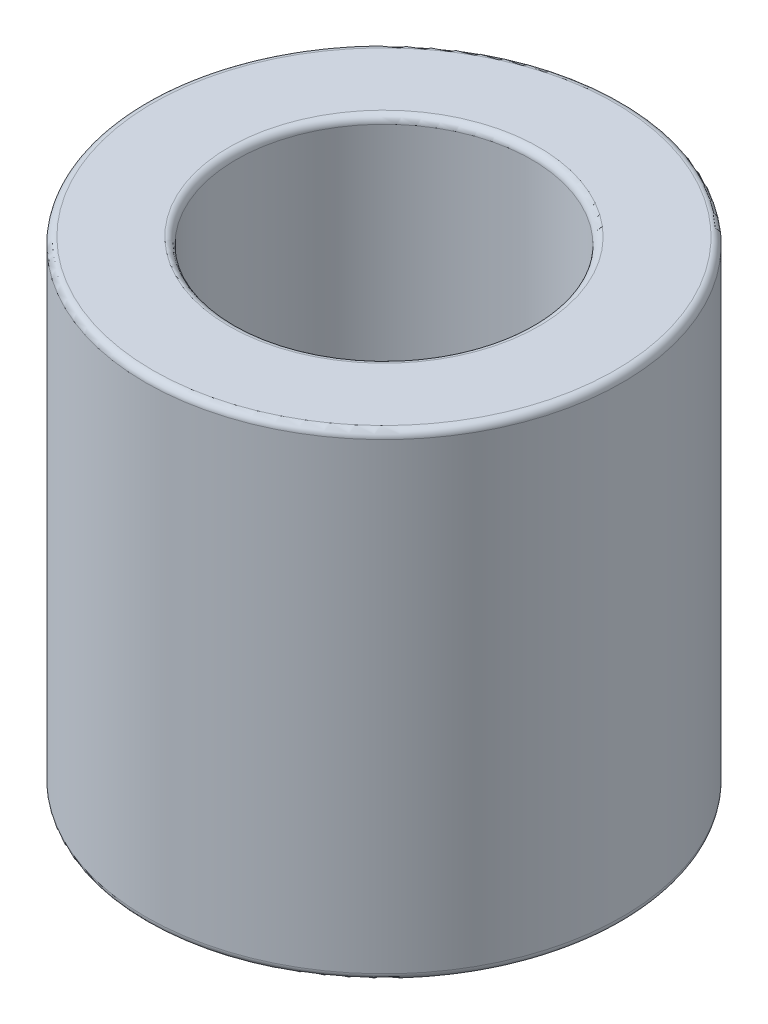
ISO-10303-21;
HEADER;
FILE_DESCRIPTION(('STEP AP214'),'2;1');
FILE_NAME('part.step','',(''),(''),'','','');
FILE_SCHEMA(('AUTOMOTIVE_DESIGN { 1 0 10303 214 1 1 1 1 }'));
ENDSEC;
DATA;
#1=APPLICATION_CONTEXT('core data for automotive mechanical design processes');
#2=APPLICATION_PROTOCOL_DEFINITION('international standard','automotive_design',2000,#1);
#3=PRODUCT_CONTEXT('',#1,'mechanical');
#4=PRODUCT('Part','Part','',(#3));
#5=PRODUCT_RELATED_PRODUCT_CATEGORY('part','',(#4));
#6=PRODUCT_DEFINITION_FORMATION('','',#4);
#7=PRODUCT_DEFINITION_CONTEXT('part definition',#1,'design');
#8=PRODUCT_DEFINITION('design','',#6,#7);
#9=PRODUCT_DEFINITION_SHAPE('','',#8);
#10=(LENGTH_UNIT() NAMED_UNIT(*) SI_UNIT(.MILLI.,.METRE.));
#11=(NAMED_UNIT(*) PLANE_ANGLE_UNIT() SI_UNIT($,.RADIAN.));
#12=(NAMED_UNIT(*) SI_UNIT($,.STERADIAN.) SOLID_ANGLE_UNIT());
#13=UNCERTAINTY_MEASURE_WITH_UNIT(LENGTH_MEASURE(1.E-05),#10,'distance_accuracy_value','');
#14=(GEOMETRIC_REPRESENTATION_CONTEXT(3) GLOBAL_UNCERTAINTY_ASSIGNED_CONTEXT((#13)) GLOBAL_UNIT_ASSIGNED_CONTEXT((#10,
#11,#12)) REPRESENTATION_CONTEXT('',''));
#15=CARTESIAN_POINT('',(0.,0.,0.));
#16=DIRECTION('',(0.,0.,1.));
#17=DIRECTION('',(1.,0.,0.));
#18=AXIS2_PLACEMENT_3D('',#15,#16,#17);
#19=CARTESIAN_POINT('',(0.,10.,0.));
#20=DIRECTION('',(0.,1.,0.));
#21=DIRECTION('',(0.,0.,1.));
#22=AXIS2_PLACEMENT_3D('',#19,#20,#21);
#23=PLANE('',#22);
#24=CARTESIAN_POINT('',(0.,10.,0.));
#25=DIRECTION('',(0.,1.,0.));
#26=DIRECTION('',(0.,0.,1.));
#27=AXIS2_PLACEMENT_3D('',#24,#25,#26);
#28=CIRCLE('',#27,3.25);
#29=CARTESIAN_POINT('',(0.,10.,3.25));
#30=VERTEX_POINT('',#29);
#31=EDGE_CURVE('E10',#30,#30,#28,.F.);
#32=ORIENTED_EDGE('',*,*,#31,.T.);
#33=EDGE_LOOP('',(#32));
#34=FACE_BOUND('',#33,.T.);
#35=CARTESIAN_POINT('',(0.,10.,0.));
#36=DIRECTION('',(0.,1.,0.));
#37=DIRECTION('',(0.,0.,1.));
#38=AXIS2_PLACEMENT_3D('',#35,#36,#37);
#39=CIRCLE('',#38,4.85);
#40=CARTESIAN_POINT('',(0.,10.,4.85));
#41=VERTEX_POINT('',#40);
#42=EDGE_CURVE('E43',#41,#41,#39,.T.);
#43=ORIENTED_EDGE('',*,*,#42,.T.);
#44=EDGE_LOOP('',(#43));
#45=FACE_BOUND('',#44,.T.);
#46=ADVANCED_FACE('F36',(#34,#45),#23,.T.);
#47=CARTESIAN_POINT('',(0.,0.,0.));
#48=DIRECTION('',(0.,1.,0.));
#49=DIRECTION('',(0.,0.,1.));
#50=AXIS2_PLACEMENT_3D('',#47,#48,#49);
#51=PLANE('',#50);
#52=CARTESIAN_POINT('',(0.,0.,0.));
#53=DIRECTION('',(0.,1.,0.));
#54=DIRECTION('',(0.,0.,1.));
#55=AXIS2_PLACEMENT_3D('',#52,#53,#54);
#56=CIRCLE('',#55,3.25);
#57=CARTESIAN_POINT('',(0.,0.,3.25));
#58=VERTEX_POINT('',#57);
#59=EDGE_CURVE('E62',#58,#58,#56,.T.);
#60=ORIENTED_EDGE('',*,*,#59,.T.);
#61=EDGE_LOOP('',(#60));
#62=FACE_BOUND('',#61,.T.);
#63=CARTESIAN_POINT('',(0.,0.,0.));
#64=DIRECTION('',(0.,1.,0.));
#65=DIRECTION('',(0.,0.,1.));
#66=AXIS2_PLACEMENT_3D('',#63,#64,#65);
#67=CIRCLE('',#66,4.85);
#68=CARTESIAN_POINT('',(0.,0.,4.85));
#69=VERTEX_POINT('',#68);
#70=EDGE_CURVE('E65',#69,#69,#67,.F.);
#71=ORIENTED_EDGE('',*,*,#70,.T.);
#72=EDGE_LOOP('',(#71));
#73=FACE_BOUND('',#72,.T.);
#74=ADVANCED_FACE('F69',(#62,#73),#51,.F.);
#75=CARTESIAN_POINT('',(0.,10.,0.));
#76=DIRECTION('',(0.,-1.,0.));
#77=DIRECTION('',(0.,0.,-1.));
#78=AXIS2_PLACEMENT_3D('',#75,#76,#77);
#79=CYLINDRICAL_SURFACE('',#78,5.);
#80=CARTESIAN_POINT('',(0.,0.150000000000001,0.));
#81=DIRECTION('',(0.,1.,0.));
#82=DIRECTION('',(0.,0.,1.));
#83=AXIS2_PLACEMENT_3D('',#80,#81,#82);
#84=CIRCLE('',#83,5.);
#85=CARTESIAN_POINT('',(0.,0.150000000000001,5.));
#86=VERTEX_POINT('',#85);
#87=EDGE_CURVE('E47',#86,#86,#84,.T.);
#88=ORIENTED_EDGE('',*,*,#87,.T.);
#89=EDGE_LOOP('',(#88));
#90=FACE_BOUND('',#89,.T.);
#91=CARTESIAN_POINT('',(0.,9.85,0.));
#92=DIRECTION('',(0.,1.,0.));
#93=DIRECTION('',(0.,0.,1.));
#94=AXIS2_PLACEMENT_3D('',#91,#92,#93);
#95=CIRCLE('',#94,5.);
#96=CARTESIAN_POINT('',(0.,9.85,5.));
#97=VERTEX_POINT('',#96);
#98=EDGE_CURVE('E51',#97,#97,#95,.F.);
#99=ORIENTED_EDGE('',*,*,#98,.T.);
#100=EDGE_LOOP('',(#99));
#101=FACE_BOUND('',#100,.T.);
#102=ADVANCED_FACE('F79',(#90,#101),#79,.T.);
#103=CARTESIAN_POINT('',(0.,10.,0.));
#104=DIRECTION('',(0.,-1.,0.));
#105=DIRECTION('',(0.,0.,-1.));
#106=AXIS2_PLACEMENT_3D('',#103,#104,#105);
#107=CYLINDRICAL_SURFACE('',#106,3.1);
#108=CARTESIAN_POINT('',(0.,0.150000000000001,0.));
#109=DIRECTION('',(0.,1.,0.));
#110=DIRECTION('',(0.,0.,1.));
#111=AXIS2_PLACEMENT_3D('',#108,#109,#110);
#112=CIRCLE('',#111,3.1);
#113=CARTESIAN_POINT('',(0.,0.150000000000001,3.1));
#114=VERTEX_POINT('',#113);
#115=EDGE_CURVE('E56',#114,#114,#112,.F.);
#116=ORIENTED_EDGE('',*,*,#115,.T.);
#117=EDGE_LOOP('',(#116));
#118=FACE_BOUND('',#117,.T.);
#119=CARTESIAN_POINT('',(0.,9.85,0.));
#120=DIRECTION('',(0.,1.,0.));
#121=DIRECTION('',(0.,0.,1.));
#122=AXIS2_PLACEMENT_3D('',#119,#120,#121);
#123=CIRCLE('',#122,3.1);
#124=CARTESIAN_POINT('',(0.,9.85,3.1));
#125=VERTEX_POINT('',#124);
#126=EDGE_CURVE('E59',#125,#125,#123,.T.);
#127=ORIENTED_EDGE('',*,*,#126,.T.);
#128=EDGE_LOOP('',(#127));
#129=FACE_BOUND('',#128,.T.);
#130=ADVANCED_FACE('F82',(#118,#129),#107,.F.);
#131=CARTESIAN_POINT('',(0.,0.150000000000001,0.));
#132=DIRECTION('',(0.,1.,0.));
#133=DIRECTION('',(0.,0.,1.));
#134=AXIS2_PLACEMENT_3D('',#131,#132,#133);
#135=TOROIDAL_SURFACE('',#134,3.25,0.15);
#136=ORIENTED_EDGE('',*,*,#115,.F.);
#137=EDGE_LOOP('',(#136));
#138=FACE_BOUND('',#137,.T.);
#139=ORIENTED_EDGE('',*,*,#59,.F.);
#140=EDGE_LOOP('',(#139));
#141=FACE_BOUND('',#140,.T.);
#142=ADVANCED_FACE('F75',(#138,#141),#135,.T.);
#143=CARTESIAN_POINT('',(0.,0.150000000000001,0.));
#144=DIRECTION('',(0.,1.,0.));
#145=DIRECTION('',(0.,0.,1.));
#146=AXIS2_PLACEMENT_3D('',#143,#144,#145);
#147=TOROIDAL_SURFACE('',#146,4.85,0.15);
#148=ORIENTED_EDGE('',*,*,#70,.F.);
#149=EDGE_LOOP('',(#148));
#150=FACE_BOUND('',#149,.T.);
#151=ORIENTED_EDGE('',*,*,#87,.F.);
#152=EDGE_LOOP('',(#151));
#153=FACE_BOUND('',#152,.T.);
#154=ADVANCED_FACE('F71',(#150,#153),#147,.T.);
#155=CARTESIAN_POINT('',(0.,9.85,0.));
#156=DIRECTION('',(0.,1.,0.));
#157=DIRECTION('',(0.,0.,1.));
#158=AXIS2_PLACEMENT_3D('',#155,#156,#157);
#159=TOROIDAL_SURFACE('',#158,3.25,0.15);
#160=ORIENTED_EDGE('',*,*,#31,.F.);
#161=EDGE_LOOP('',(#160));
#162=FACE_BOUND('',#161,.T.);
#163=ORIENTED_EDGE('',*,*,#126,.F.);
#164=EDGE_LOOP('',(#163));
#165=FACE_BOUND('',#164,.T.);
#166=ADVANCED_FACE('F74',(#162,#165),#159,.T.);
#167=CARTESIAN_POINT('',(0.,9.85,0.));
#168=DIRECTION('',(0.,1.,0.));
#169=DIRECTION('',(0.,0.,1.));
#170=AXIS2_PLACEMENT_3D('',#167,#168,#169);
#171=TOROIDAL_SURFACE('',#170,4.85,0.15);
#172=ORIENTED_EDGE('',*,*,#98,.F.);
#173=EDGE_LOOP('',(#172));
#174=FACE_BOUND('',#173,.T.);
#175=ORIENTED_EDGE('',*,*,#42,.F.);
#176=EDGE_LOOP('',(#175));
#177=FACE_BOUND('',#176,.T.);
#178=ADVANCED_FACE('F38',(#174,#177),#171,.T.);
#179=CLOSED_SHELL('',(#46,#74,#102,#130,#142,#154,#166,#178));
#180=MANIFOLD_SOLID_BREP('B2',#179);
#181=ADVANCED_BREP_SHAPE_REPRESENTATION('',(#18,#180),#14);
#182=SHAPE_DEFINITION_REPRESENTATION(#9,#181);
ENDSEC;
END-ISO-10303-21;
